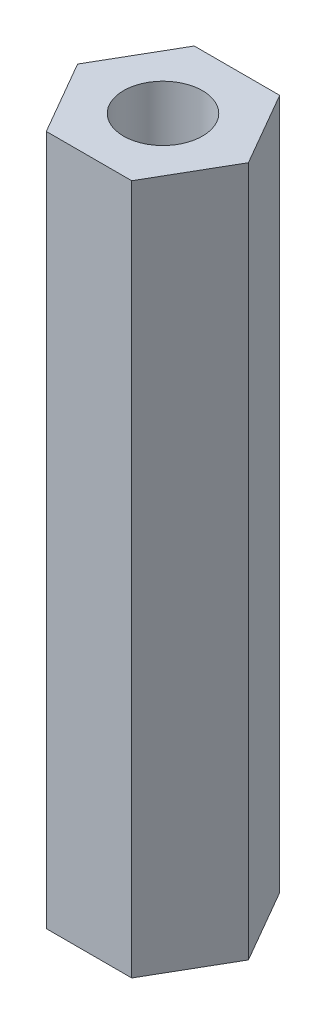
ISO-10303-21;
HEADER;
FILE_DESCRIPTION(('STEP AP214'),'2;1');
FILE_NAME('part.step','',(''),(''),'','','');
FILE_SCHEMA(('AUTOMOTIVE_DESIGN { 1 0 10303 214 1 1 1 1 }'));
ENDSEC;
DATA;
#1=APPLICATION_CONTEXT('core data for automotive mechanical design processes');
#2=APPLICATION_PROTOCOL_DEFINITION('international standard','automotive_design',2000,#1);
#3=PRODUCT_CONTEXT('',#1,'mechanical');
#4=PRODUCT('Part','Part','',(#3));
#5=PRODUCT_RELATED_PRODUCT_CATEGORY('part','',(#4));
#6=PRODUCT_DEFINITION_FORMATION('','',#4);
#7=PRODUCT_DEFINITION_CONTEXT('part definition',#1,'design');
#8=PRODUCT_DEFINITION('design','',#6,#7);
#9=PRODUCT_DEFINITION_SHAPE('','',#8);
#10=(LENGTH_UNIT() NAMED_UNIT(*) SI_UNIT(.MILLI.,.METRE.));
#11=(NAMED_UNIT(*) PLANE_ANGLE_UNIT() SI_UNIT($,.RADIAN.));
#12=(NAMED_UNIT(*) SI_UNIT($,.STERADIAN.) SOLID_ANGLE_UNIT());
#13=UNCERTAINTY_MEASURE_WITH_UNIT(LENGTH_MEASURE(1.E-05),#10,'distance_accuracy_value','');
#14=(GEOMETRIC_REPRESENTATION_CONTEXT(3) GLOBAL_UNCERTAINTY_ASSIGNED_CONTEXT((#13)) GLOBAL_UNIT_ASSIGNED_CONTEXT((#10,
#11,#12)) REPRESENTATION_CONTEXT('',''));
#15=CARTESIAN_POINT('',(0.,0.,0.));
#16=DIRECTION('',(0.,0.,1.));
#17=DIRECTION('',(1.,0.,0.));
#18=AXIS2_PLACEMENT_3D('',#15,#16,#17);
#19=CARTESIAN_POINT('',(0.,35.,0.));
#20=DIRECTION('',(0.,1.,0.));
#21=DIRECTION('',(0.,0.,1.));
#22=AXIS2_PLACEMENT_3D('',#19,#20,#21);
#23=PLANE('',#22);
#24=DIRECTION('',(-0.5,0.,-0.866025403784438));
#25=VECTOR('',#24,1.);
#26=CARTESIAN_POINT('',(4.33012701892219,35.,0.));
#27=LINE('',#26,#25);
#28=CARTESIAN_POINT('',(4.33012701892219,35.,0.));
#29=VERTEX_POINT('',#28);
#30=CARTESIAN_POINT('',(2.1650635094611,35.,-3.75));
#31=VERTEX_POINT('',#30);
#32=EDGE_CURVE('E152',#29,#31,#27,.T.);
#33=ORIENTED_EDGE('',*,*,#32,.T.);
#34=DIRECTION('',(-1.,0.,0.));
#35=VECTOR('',#34,1.);
#36=CARTESIAN_POINT('',(2.1650635094611,35.,-3.75));
#37=LINE('',#36,#35);
#38=CARTESIAN_POINT('',(-2.1650635094611,35.,-3.75));
#39=VERTEX_POINT('',#38);
#40=EDGE_CURVE('E100',#31,#39,#37,.T.);
#41=ORIENTED_EDGE('',*,*,#40,.T.);
#42=DIRECTION('',(-0.5,0.,0.866025403784439));
#43=VECTOR('',#42,1.);
#44=CARTESIAN_POINT('',(-2.1650635094611,35.,-3.75));
#45=LINE('',#44,#43);
#46=CARTESIAN_POINT('',(-4.33012701892219,35.,0.));
#47=VERTEX_POINT('',#46);
#48=EDGE_CURVE('E113',#39,#47,#45,.T.);
#49=ORIENTED_EDGE('',*,*,#48,.T.);
#50=DIRECTION('',(0.5,0.,0.866025403784438));
#51=VECTOR('',#50,1.);
#52=CARTESIAN_POINT('',(-4.33012701892219,35.,0.));
#53=LINE('',#52,#51);
#54=CARTESIAN_POINT('',(-2.16506350946109,35.,3.75));
#55=VERTEX_POINT('',#54);
#56=EDGE_CURVE('E107',#47,#55,#53,.T.);
#57=ORIENTED_EDGE('',*,*,#56,.T.);
#58=DIRECTION('',(1.,0.,0.));
#59=VECTOR('',#58,1.);
#60=CARTESIAN_POINT('',(-2.16506350946109,35.,3.75));
#61=LINE('',#60,#59);
#62=CARTESIAN_POINT('',(2.1650635094611,35.,3.75));
#63=VERTEX_POINT('',#62);
#64=EDGE_CURVE('E111',#55,#63,#61,.T.);
#65=ORIENTED_EDGE('',*,*,#64,.T.);
#66=DIRECTION('',(0.5,0.,-0.866025403784439));
#67=VECTOR('',#66,1.);
#68=CARTESIAN_POINT('',(2.1650635094611,35.,3.75));
#69=LINE('',#68,#67);
#70=EDGE_CURVE('E63',#63,#29,#69,.T.);
#71=ORIENTED_EDGE('',*,*,#70,.T.);
#72=EDGE_LOOP('',(#33,#41,#49,#57,#65,#71));
#73=FACE_BOUND('',#72,.T.);
#74=CARTESIAN_POINT('',(0.,35.,0.));
#75=DIRECTION('',(0.,1.,0.));
#76=DIRECTION('',(0.,0.,1.));
#77=AXIS2_PLACEMENT_3D('',#74,#75,#76);
#78=CIRCLE('',#77,2.);
#79=CARTESIAN_POINT('',(0.,35.,2.));
#80=VERTEX_POINT('',#79);
#81=EDGE_CURVE('E140',#80,#80,#78,.T.);
#82=ORIENTED_EDGE('',*,*,#81,.F.);
#83=EDGE_LOOP('',(#82));
#84=FACE_BOUND('',#83,.T.);
#85=ADVANCED_FACE('F45',(#73,#84),#23,.T.);
#86=CARTESIAN_POINT('',(0.,0.,0.));
#87=DIRECTION('',(0.,1.,0.));
#88=DIRECTION('',(0.,0.,1.));
#89=AXIS2_PLACEMENT_3D('',#86,#87,#88);
#90=PLANE('',#89);
#91=DIRECTION('',(-0.5,0.,-0.866025403784438));
#92=VECTOR('',#91,1.);
#93=CARTESIAN_POINT('',(4.33012701892219,0.,0.));
#94=LINE('',#93,#92);
#95=CARTESIAN_POINT('',(4.33012701892219,0.,0.));
#96=VERTEX_POINT('',#95);
#97=CARTESIAN_POINT('',(2.1650635094611,0.,-3.75));
#98=VERTEX_POINT('',#97);
#99=EDGE_CURVE('E135',#96,#98,#94,.T.);
#100=ORIENTED_EDGE('',*,*,#99,.F.);
#101=DIRECTION('',(0.5,0.,-0.866025403784439));
#102=VECTOR('',#101,1.);
#103=CARTESIAN_POINT('',(2.1650635094611,0.,3.75));
#104=LINE('',#103,#102);
#105=CARTESIAN_POINT('',(2.1650635094611,0.,3.75));
#106=VERTEX_POINT('',#105);
#107=EDGE_CURVE('E92',#106,#96,#104,.T.);
#108=ORIENTED_EDGE('',*,*,#107,.F.);
#109=DIRECTION('',(1.,0.,0.));
#110=VECTOR('',#109,1.);
#111=CARTESIAN_POINT('',(-2.16506350946109,0.,3.75));
#112=LINE('',#111,#110);
#113=CARTESIAN_POINT('',(-2.16506350946109,0.,3.75));
#114=VERTEX_POINT('',#113);
#115=EDGE_CURVE('E86',#114,#106,#112,.T.);
#116=ORIENTED_EDGE('',*,*,#115,.F.);
#117=DIRECTION('',(0.5,0.,0.866025403784438));
#118=VECTOR('',#117,1.);
#119=CARTESIAN_POINT('',(-4.33012701892219,0.,0.));
#120=LINE('',#119,#118);
#121=CARTESIAN_POINT('',(-4.33012701892219,0.,0.));
#122=VERTEX_POINT('',#121);
#123=EDGE_CURVE('E122',#122,#114,#120,.T.);
#124=ORIENTED_EDGE('',*,*,#123,.F.);
#125=DIRECTION('',(-0.5,0.,0.866025403784439));
#126=VECTOR('',#125,1.);
#127=CARTESIAN_POINT('',(-2.1650635094611,0.,-3.75));
#128=LINE('',#127,#126);
#129=CARTESIAN_POINT('',(-2.1650635094611,0.,-3.75));
#130=VERTEX_POINT('',#129);
#131=EDGE_CURVE('E143',#130,#122,#128,.T.);
#132=ORIENTED_EDGE('',*,*,#131,.F.);
#133=DIRECTION('',(-1.,0.,0.));
#134=VECTOR('',#133,1.);
#135=CARTESIAN_POINT('',(2.1650635094611,0.,-3.75));
#136=LINE('',#135,#134);
#137=EDGE_CURVE('E139',#98,#130,#136,.T.);
#138=ORIENTED_EDGE('',*,*,#137,.F.);
#139=EDGE_LOOP('',(#100,#108,#116,#124,#132,#138));
#140=FACE_BOUND('',#139,.T.);
#141=CARTESIAN_POINT('',(0.,0.,0.));
#142=DIRECTION('',(0.,1.,0.));
#143=DIRECTION('',(0.,0.,1.));
#144=AXIS2_PLACEMENT_3D('',#141,#142,#143);
#145=CIRCLE('',#144,2.);
#146=CARTESIAN_POINT('',(0.,0.,2.));
#147=VERTEX_POINT('',#146);
#148=EDGE_CURVE('E267',#147,#147,#145,.T.);
#149=ORIENTED_EDGE('',*,*,#148,.T.);
#150=EDGE_LOOP('',(#149));
#151=FACE_BOUND('',#150,.T.);
#152=ADVANCED_FACE('F165',(#140,#151),#90,.F.);
#153=CARTESIAN_POINT('',(4.33012701892219,35.,0.));
#154=DIRECTION('',(-0.866025403784439,0.,0.5));
#155=DIRECTION('',(0.5,0.,0.866025403784439));
#156=AXIS2_PLACEMENT_3D('',#153,#154,#155);
#157=PLANE('',#156);
#158=ORIENTED_EDGE('',*,*,#99,.T.);
#159=DIRECTION('',(0.,-1.,0.));
#160=VECTOR('',#159,1.);
#161=CARTESIAN_POINT('',(2.1650635094611,35.,-3.75));
#162=LINE('',#161,#160);
#163=EDGE_CURVE('E11',#31,#98,#162,.T.);
#164=ORIENTED_EDGE('',*,*,#163,.F.);
#165=ORIENTED_EDGE('',*,*,#32,.F.);
#166=DIRECTION('',(0.,-1.,0.));
#167=VECTOR('',#166,1.);
#168=CARTESIAN_POINT('',(4.33012701892219,35.,0.));
#169=LINE('',#168,#167);
#170=EDGE_CURVE('E131',#29,#96,#169,.T.);
#171=ORIENTED_EDGE('',*,*,#170,.T.);
#172=EDGE_LOOP('',(#158,#164,#165,#171));
#173=FACE_BOUND('',#172,.T.);
#174=ADVANCED_FACE('F47',(#173),#157,.F.);
#175=CARTESIAN_POINT('',(2.1650635094611,35.,-3.75));
#176=DIRECTION('',(0.,0.,1.));
#177=DIRECTION('',(1.,0.,0.));
#178=AXIS2_PLACEMENT_3D('',#175,#176,#177);
#179=PLANE('',#178);
#180=ORIENTED_EDGE('',*,*,#137,.T.);
#181=DIRECTION('',(0.,-1.,0.));
#182=VECTOR('',#181,1.);
#183=CARTESIAN_POINT('',(-2.1650635094611,35.,-3.75));
#184=LINE('',#183,#182);
#185=EDGE_CURVE('E55',#39,#130,#184,.T.);
#186=ORIENTED_EDGE('',*,*,#185,.F.);
#187=ORIENTED_EDGE('',*,*,#40,.F.);
#188=ORIENTED_EDGE('',*,*,#163,.T.);
#189=EDGE_LOOP('',(#180,#186,#187,#188));
#190=FACE_BOUND('',#189,.T.);
#191=ADVANCED_FACE('F190',(#190),#179,.F.);
#192=CARTESIAN_POINT('',(-2.1650635094611,35.,-3.75));
#193=DIRECTION('',(0.866025403784439,0.,0.5));
#194=DIRECTION('',(0.5,0.,-0.866025403784439));
#195=AXIS2_PLACEMENT_3D('',#192,#193,#194);
#196=PLANE('',#195);
#197=ORIENTED_EDGE('',*,*,#131,.T.);
#198=DIRECTION('',(0.,-1.,0.));
#199=VECTOR('',#198,1.);
#200=CARTESIAN_POINT('',(-4.33012701892219,35.,0.));
#201=LINE('',#200,#199);
#202=EDGE_CURVE('E124',#47,#122,#201,.T.);
#203=ORIENTED_EDGE('',*,*,#202,.F.);
#204=ORIENTED_EDGE('',*,*,#48,.F.);
#205=ORIENTED_EDGE('',*,*,#185,.T.);
#206=EDGE_LOOP('',(#197,#203,#204,#205));
#207=FACE_BOUND('',#206,.T.);
#208=ADVANCED_FACE('F162',(#207),#196,.F.);
#209=CARTESIAN_POINT('',(-4.33012701892219,35.,0.));
#210=DIRECTION('',(0.866025403784438,0.,-0.5));
#211=DIRECTION('',(-0.5,0.,-0.866025403784438));
#212=AXIS2_PLACEMENT_3D('',#209,#210,#211);
#213=PLANE('',#212);
#214=ORIENTED_EDGE('',*,*,#123,.T.);
#215=DIRECTION('',(0.,-1.,0.));
#216=VECTOR('',#215,1.);
#217=CARTESIAN_POINT('',(-2.16506350946109,35.,3.75));
#218=LINE('',#217,#216);
#219=EDGE_CURVE('E119',#55,#114,#218,.T.);
#220=ORIENTED_EDGE('',*,*,#219,.F.);
#221=ORIENTED_EDGE('',*,*,#56,.F.);
#222=ORIENTED_EDGE('',*,*,#202,.T.);
#223=EDGE_LOOP('',(#214,#220,#221,#222));
#224=FACE_BOUND('',#223,.T.);
#225=ADVANCED_FACE('F120',(#224),#213,.F.);
#226=CARTESIAN_POINT('',(-2.16506350946109,35.,3.75));
#227=DIRECTION('',(0.,0.,-1.));
#228=DIRECTION('',(-1.,0.,0.));
#229=AXIS2_PLACEMENT_3D('',#226,#227,#228);
#230=PLANE('',#229);
#231=ORIENTED_EDGE('',*,*,#115,.T.);
#232=DIRECTION('',(0.,-1.,0.));
#233=VECTOR('',#232,1.);
#234=CARTESIAN_POINT('',(2.1650635094611,35.,3.75));
#235=LINE('',#234,#233);
#236=EDGE_CURVE('E125',#63,#106,#235,.T.);
#237=ORIENTED_EDGE('',*,*,#236,.F.);
#238=ORIENTED_EDGE('',*,*,#64,.F.);
#239=ORIENTED_EDGE('',*,*,#219,.T.);
#240=EDGE_LOOP('',(#231,#237,#238,#239));
#241=FACE_BOUND('',#240,.T.);
#242=ADVANCED_FACE('F127',(#241),#230,.F.);
#243=CARTESIAN_POINT('',(2.1650635094611,35.,3.75));
#244=DIRECTION('',(-0.866025403784439,0.,-0.5));
#245=DIRECTION('',(-0.5,0.,0.866025403784439));
#246=AXIS2_PLACEMENT_3D('',#243,#244,#245);
#247=PLANE('',#246);
#248=ORIENTED_EDGE('',*,*,#107,.T.);
#249=ORIENTED_EDGE('',*,*,#170,.F.);
#250=ORIENTED_EDGE('',*,*,#70,.F.);
#251=ORIENTED_EDGE('',*,*,#236,.T.);
#252=EDGE_LOOP('',(#248,#249,#250,#251));
#253=FACE_BOUND('',#252,.T.);
#254=ADVANCED_FACE('F170',(#253),#247,.F.);
#255=CARTESIAN_POINT('',(0.,35.,0.));
#256=DIRECTION('',(0.,-1.,0.));
#257=DIRECTION('',(0.,0.,-1.));
#258=AXIS2_PLACEMENT_3D('',#255,#256,#257);
#259=CYLINDRICAL_SURFACE('',#258,2.);
#260=ORIENTED_EDGE('',*,*,#81,.T.);
#261=EDGE_LOOP('',(#260));
#262=FACE_BOUND('',#261,.T.);
#263=ORIENTED_EDGE('',*,*,#148,.F.);
#264=EDGE_LOOP('',(#263));
#265=FACE_BOUND('',#264,.T.);
#266=ADVANCED_FACE('F172',(#262,#265),#259,.F.);
#267=CLOSED_SHELL('',(#85,#152,#174,#191,#208,#225,#242,#254,#266));
#268=MANIFOLD_SOLID_BREP('B2',#267);
#269=ADVANCED_BREP_SHAPE_REPRESENTATION('',(#18,#268),#14);
#270=SHAPE_DEFINITION_REPRESENTATION(#9,#269);
ENDSEC;
END-ISO-10303-21;
